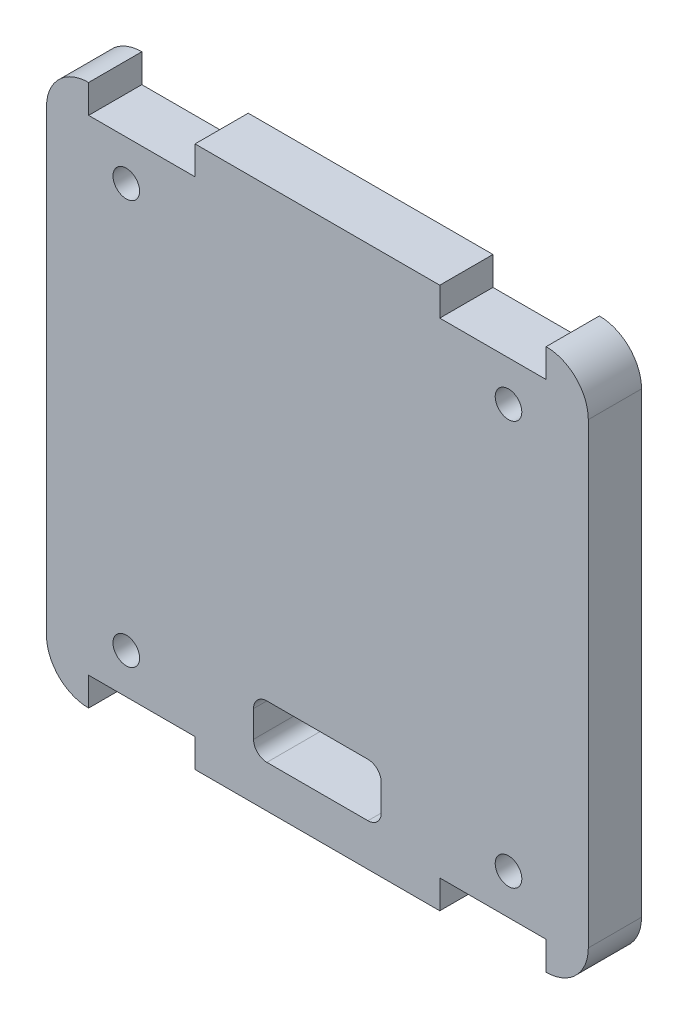
ISO-10303-21;
HEADER;
FILE_DESCRIPTION(('STEP AP214'),'2;1');
FILE_NAME('part.step','',(''),(''),'','','');
FILE_SCHEMA(('AUTOMOTIVE_DESIGN { 1 0 10303 214 1 1 1 1 }'));
ENDSEC;
DATA;
#1=APPLICATION_CONTEXT('core data for automotive mechanical design processes');
#2=APPLICATION_PROTOCOL_DEFINITION('international standard','automotive_design',2000,#1);
#3=PRODUCT_CONTEXT('',#1,'mechanical');
#4=PRODUCT('Part','Part','',(#3));
#5=PRODUCT_RELATED_PRODUCT_CATEGORY('part','',(#4));
#6=PRODUCT_DEFINITION_FORMATION('','',#4);
#7=PRODUCT_DEFINITION_CONTEXT('part definition',#1,'design');
#8=PRODUCT_DEFINITION('design','',#6,#7);
#9=PRODUCT_DEFINITION_SHAPE('','',#8);
#10=(LENGTH_UNIT() NAMED_UNIT(*) SI_UNIT(.MILLI.,.METRE.));
#11=(NAMED_UNIT(*) PLANE_ANGLE_UNIT() SI_UNIT($,.RADIAN.));
#12=(NAMED_UNIT(*) SI_UNIT($,.STERADIAN.) SOLID_ANGLE_UNIT());
#13=UNCERTAINTY_MEASURE_WITH_UNIT(LENGTH_MEASURE(1.E-05),#10,'distance_accuracy_value','');
#14=(GEOMETRIC_REPRESENTATION_CONTEXT(3) GLOBAL_UNCERTAINTY_ASSIGNED_CONTEXT((#13)) GLOBAL_UNIT_ASSIGNED_CONTEXT((#10,
#11,#12)) REPRESENTATION_CONTEXT('',''));
#15=CARTESIAN_POINT('',(0.,0.,0.));
#16=DIRECTION('',(0.,0.,1.));
#17=DIRECTION('',(1.,0.,0.));
#18=AXIS2_PLACEMENT_3D('',#15,#16,#17);
#19=CARTESIAN_POINT('',(8667.40632080673,2967.6948528034,6.35));
#20=DIRECTION('',(0.,0.,1.));
#21=DIRECTION('',(1.,0.,0.));
#22=AXIS2_PLACEMENT_3D('',#19,#20,#21);
#23=PLANE('',#22);
#24=CARTESIAN_POINT('',(8617.29212080673,2916.2598528034,6.35));
#25=DIRECTION('',(0.,0.,1.));
#26=DIRECTION('',(1.,0.,0.));
#27=AXIS2_PLACEMENT_3D('',#24,#25,#26);
#28=CIRCLE('',#27,1.58749999999941);
#29=CARTESIAN_POINT('',(8618.87962080673,2916.2598528034,6.35));
#30=VERTEX_POINT('',#29);
#31=EDGE_CURVE('E287',#30,#30,#28,.T.);
#32=ORIENTED_EDGE('',*,*,#31,.F.);
#33=EDGE_LOOP('',(#32));
#34=FACE_BOUND('',#33,.T.);
#35=CARTESIAN_POINT('',(8662.91052080673,2916.2598528034,6.35));
#36=DIRECTION('',(0.,0.,1.));
#37=DIRECTION('',(1.,0.,0.));
#38=AXIS2_PLACEMENT_3D('',#35,#36,#37);
#39=CIRCLE('',#38,1.58749999999941);
#40=CARTESIAN_POINT('',(8664.49802080673,2916.2598528034,6.35));
#41=VERTEX_POINT('',#40);
#42=EDGE_CURVE('E299',#41,#41,#39,.T.);
#43=ORIENTED_EDGE('',*,*,#42,.F.);
#44=EDGE_LOOP('',(#43));
#45=FACE_BOUND('',#44,.T.);
#46=CARTESIAN_POINT('',(8667.40632080673,2967.6948528034,6.35));
#47=DIRECTION('',(0.,0.,1.));
#48=DIRECTION('',(1.,0.,0.));
#49=AXIS2_PLACEMENT_3D('',#46,#47,#48);
#50=CIRCLE('',#49,5.02920000000051);
#51=CARTESIAN_POINT('',(8672.43552080673,2967.6948528034,6.35));
#52=VERTEX_POINT('',#51);
#53=CARTESIAN_POINT('',(8667.40632080673,2972.7240528034,6.35));
#54=VERTEX_POINT('',#53);
#55=EDGE_CURVE('E311',#52,#54,#50,.T.);
#56=ORIENTED_EDGE('',*,*,#55,.T.);
#57=DIRECTION('',(-1.04381057668354E-12,-1.,0.));
#58=VECTOR('',#57,1.);
#59=CARTESIAN_POINT('',(8667.40632080673,2969.3204528034,6.35));
#60=LINE('',#59,#58);
#61=CARTESIAN_POINT('',(8667.40632080673,2969.3204528034,6.35));
#62=VERTEX_POINT('',#61);
#63=EDGE_CURVE('E314',#54,#62,#60,.T.);
#64=ORIENTED_EDGE('',*,*,#63,.T.);
#65=DIRECTION('',(-1.,0.,0.));
#66=VECTOR('',#65,1.);
#67=CARTESIAN_POINT('',(8654.70632080673,2969.3204528034,6.35));
#68=LINE('',#67,#66);
#69=CARTESIAN_POINT('',(8654.70632080673,2969.3204528034,6.35));
#70=VERTEX_POINT('',#69);
#71=EDGE_CURVE('E317',#62,#70,#68,.T.);
#72=ORIENTED_EDGE('',*,*,#71,.T.);
#73=DIRECTION('',(1.04381057668354E-12,1.,0.));
#74=VECTOR('',#73,1.);
#75=CARTESIAN_POINT('',(8654.70632080673,2969.3204528034,6.35));
#76=LINE('',#75,#74);
#77=CARTESIAN_POINT('',(8654.70632080674,2972.7240528034,6.35));
#78=VERTEX_POINT('',#77);
#79=EDGE_CURVE('E319',#70,#78,#76,.T.);
#80=ORIENTED_EDGE('',*,*,#79,.T.);
#81=DIRECTION('',(-1.,0.,0.));
#82=VECTOR('',#81,1.);
#83=CARTESIAN_POINT('',(8625.49632080673,2972.7240528034,6.35));
#84=LINE('',#83,#82);
#85=CARTESIAN_POINT('',(8625.49632080673,2972.7240528034,6.35));
#86=VERTEX_POINT('',#85);
#87=EDGE_CURVE('E321',#78,#86,#84,.T.);
#88=ORIENTED_EDGE('',*,*,#87,.T.);
#89=DIRECTION('',(0.,-1.,0.));
#90=VECTOR('',#89,1.);
#91=CARTESIAN_POINT('',(8625.49632080673,2969.3204528034,6.35));
#92=LINE('',#91,#90);
#93=CARTESIAN_POINT('',(8625.49632080673,2969.3204528034,6.35));
#94=VERTEX_POINT('',#93);
#95=EDGE_CURVE('E323',#86,#94,#92,.T.);
#96=ORIENTED_EDGE('',*,*,#95,.T.);
#97=DIRECTION('',(-1.,0.,0.));
#98=VECTOR('',#97,1.);
#99=CARTESIAN_POINT('',(8612.79632080673,2969.3204528034,6.35));
#100=LINE('',#99,#98);
#101=CARTESIAN_POINT('',(8612.79632080673,2969.3204528034,6.35));
#102=VERTEX_POINT('',#101);
#103=EDGE_CURVE('E325',#94,#102,#100,.T.);
#104=ORIENTED_EDGE('',*,*,#103,.T.);
#105=DIRECTION('',(0.,1.,0.));
#106=VECTOR('',#105,1.);
#107=CARTESIAN_POINT('',(8612.79632080673,2969.3204528034,6.35));
#108=LINE('',#107,#106);
#109=CARTESIAN_POINT('',(8612.79632080673,2972.7240528034,6.35));
#110=VERTEX_POINT('',#109);
#111=EDGE_CURVE('E327',#102,#110,#108,.T.);
#112=ORIENTED_EDGE('',*,*,#111,.T.);
#113=CARTESIAN_POINT('',(8612.79632080673,2967.6948528034,6.35));
#114=DIRECTION('',(0.,0.,1.));
#115=DIRECTION('',(1.,0.,0.));
#116=AXIS2_PLACEMENT_3D('',#113,#114,#115);
#117=CIRCLE('',#116,5.02919999999896);
#118=CARTESIAN_POINT('',(8607.76712080673,2967.6948528034,6.35));
#119=VERTEX_POINT('',#118);
#120=EDGE_CURVE('E329',#110,#119,#117,.T.);
#121=ORIENTED_EDGE('',*,*,#120,.T.);
#122=DIRECTION('',(0.,-1.,0.));
#123=VECTOR('',#122,1.);
#124=CARTESIAN_POINT('',(8607.76712080673,2913.0848528034,6.35));
#125=LINE('',#124,#123);
#126=CARTESIAN_POINT('',(8607.76712080673,2913.0848528034,6.35));
#127=VERTEX_POINT('',#126);
#128=EDGE_CURVE('E331',#119,#127,#125,.T.);
#129=ORIENTED_EDGE('',*,*,#128,.T.);
#130=CARTESIAN_POINT('',(8612.79632080673,2913.0848528034,6.35));
#131=DIRECTION('',(0.,0.,1.));
#132=DIRECTION('',(1.,0.,0.));
#133=AXIS2_PLACEMENT_3D('',#130,#131,#132);
#134=CIRCLE('',#133,5.02920000000073);
#135=CARTESIAN_POINT('',(8612.79632080673,2908.0556528034,6.35));
#136=VERTEX_POINT('',#135);
#137=EDGE_CURVE('E333',#127,#136,#134,.T.);
#138=ORIENTED_EDGE('',*,*,#137,.T.);
#139=DIRECTION('',(0.,1.,0.));
#140=VECTOR('',#139,1.);
#141=CARTESIAN_POINT('',(8612.79632080673,2911.4592528034,6.35));
#142=LINE('',#141,#140);
#143=CARTESIAN_POINT('',(8612.79632080673,2911.4592528034,6.35));
#144=VERTEX_POINT('',#143);
#145=EDGE_CURVE('E335',#136,#144,#142,.T.);
#146=ORIENTED_EDGE('',*,*,#145,.T.);
#147=DIRECTION('',(1.,0.,0.));
#148=VECTOR('',#147,1.);
#149=CARTESIAN_POINT('',(8625.49632080673,2911.4592528034,6.35));
#150=LINE('',#149,#148);
#151=CARTESIAN_POINT('',(8625.49632080673,2911.4592528034,6.35));
#152=VERTEX_POINT('',#151);
#153=EDGE_CURVE('E337',#144,#152,#150,.T.);
#154=ORIENTED_EDGE('',*,*,#153,.T.);
#155=DIRECTION('',(1.04381057668381E-12,-1.,0.));
#156=VECTOR('',#155,1.);
#157=CARTESIAN_POINT('',(8625.49632080673,2911.4592528034,6.35));
#158=LINE('',#157,#156);
#159=CARTESIAN_POINT('',(8625.49632080673,2908.0556528034,6.35));
#160=VERTEX_POINT('',#159);
#161=EDGE_CURVE('E339',#152,#160,#158,.T.);
#162=ORIENTED_EDGE('',*,*,#161,.T.);
#163=DIRECTION('',(1.,0.,0.));
#164=VECTOR('',#163,1.);
#165=CARTESIAN_POINT('',(8654.70632080673,2908.0556528034,6.35));
#166=LINE('',#165,#164);
#167=CARTESIAN_POINT('',(8654.70632080673,2908.0556528034,6.35));
#168=VERTEX_POINT('',#167);
#169=EDGE_CURVE('E341',#160,#168,#166,.T.);
#170=ORIENTED_EDGE('',*,*,#169,.T.);
#171=DIRECTION('',(0.,1.,0.));
#172=VECTOR('',#171,1.);
#173=CARTESIAN_POINT('',(8654.70632080673,2911.4592528034,6.35));
#174=LINE('',#173,#172);
#175=CARTESIAN_POINT('',(8654.70632080673,2911.4592528034,6.35));
#176=VERTEX_POINT('',#175);
#177=EDGE_CURVE('E343',#168,#176,#174,.T.);
#178=ORIENTED_EDGE('',*,*,#177,.T.);
#179=DIRECTION('',(1.,0.,0.));
#180=VECTOR('',#179,1.);
#181=CARTESIAN_POINT('',(8667.40632080673,2911.4592528034,6.35));
#182=LINE('',#181,#180);
#183=CARTESIAN_POINT('',(8667.40632080673,2911.4592528034,6.35));
#184=VERTEX_POINT('',#183);
#185=EDGE_CURVE('E345',#176,#184,#182,.T.);
#186=ORIENTED_EDGE('',*,*,#185,.T.);
#187=DIRECTION('',(1.04381057668422E-12,-1.,0.));
#188=VECTOR('',#187,1.);
#189=CARTESIAN_POINT('',(8667.40632080673,2911.4592528034,6.35));
#190=LINE('',#189,#188);
#191=CARTESIAN_POINT('',(8667.40632080673,2908.0556528034,6.35));
#192=VERTEX_POINT('',#191);
#193=EDGE_CURVE('E347',#184,#192,#190,.T.);
#194=ORIENTED_EDGE('',*,*,#193,.T.);
#195=CARTESIAN_POINT('',(8667.40632080673,2913.0848528034,6.35));
#196=DIRECTION('',(0.,0.,1.));
#197=DIRECTION('',(1.,0.,0.));
#198=AXIS2_PLACEMENT_3D('',#195,#196,#197);
#199=CIRCLE('',#198,5.02919999999896);
#200=CARTESIAN_POINT('',(8672.43552080673,2913.0848528034,6.35));
#201=VERTEX_POINT('',#200);
#202=EDGE_CURVE('E349',#192,#201,#199,.T.);
#203=ORIENTED_EDGE('',*,*,#202,.T.);
#204=DIRECTION('',(0.,1.,0.));
#205=VECTOR('',#204,1.);
#206=CARTESIAN_POINT('',(8672.43552080673,2967.6948528034,6.35));
#207=LINE('',#206,#205);
#208=EDGE_CURVE('E351',#201,#52,#207,.T.);
#209=ORIENTED_EDGE('',*,*,#208,.T.);
#210=EDGE_LOOP('',(#56,#64,#72,#80,#88,#96,#104,#112,#121,#129,#138,#146,#154,#162,#170,#178,
#186,#194,#203,#209));
#211=FACE_BOUND('',#210,.T.);
#212=CARTESIAN_POINT('',(8662.91052080673,2964.5198528034,6.35));
#213=DIRECTION('',(0.,0.,1.));
#214=DIRECTION('',(1.,0.,0.));
#215=AXIS2_PLACEMENT_3D('',#212,#213,#214);
#216=CIRCLE('',#215,1.58749999999941);
#217=CARTESIAN_POINT('',(8664.49802080673,2964.5198528034,6.35));
#218=VERTEX_POINT('',#217);
#219=EDGE_CURVE('E305',#218,#218,#216,.T.);
#220=ORIENTED_EDGE('',*,*,#219,.F.);
#221=EDGE_LOOP('',(#220));
#222=FACE_BOUND('',#221,.T.);
#223=CARTESIAN_POINT('',(8617.29212080673,2964.5198528034,6.35));
#224=DIRECTION('',(0.,0.,1.));
#225=DIRECTION('',(1.,0.,0.));
#226=AXIS2_PLACEMENT_3D('',#223,#224,#225);
#227=CIRCLE('',#226,1.58749999999941);
#228=CARTESIAN_POINT('',(8618.87962080673,2964.5198528034,6.35));
#229=VERTEX_POINT('',#228);
#230=EDGE_CURVE('E293',#229,#229,#227,.T.);
#231=ORIENTED_EDGE('',*,*,#230,.F.);
#232=EDGE_LOOP('',(#231));
#233=FACE_BOUND('',#232,.T.);
#234=DIRECTION('',(1.,0.,0.));
#235=VECTOR('',#234,1.);
#236=CARTESIAN_POINT('',(8634.06882080673,2913.0848528034,6.35));
#237=LINE('',#236,#235);
#238=CARTESIAN_POINT('',(8634.06882080673,2913.0848528034,6.35));
#239=VERTEX_POINT('',#238);
#240=CARTESIAN_POINT('',(8646.13382080673,2913.0848528034,6.35));
#241=VERTEX_POINT('',#240);
#242=EDGE_CURVE('E230',#239,#241,#237,.T.);
#243=ORIENTED_EDGE('',*,*,#242,.F.);
#244=CARTESIAN_POINT('',(8634.06882080673,2914.6723528034,6.35));
#245=DIRECTION('',(0.,0.,1.));
#246=DIRECTION('',(1.,0.,0.));
#247=AXIS2_PLACEMENT_3D('',#244,#245,#246);
#248=CIRCLE('',#247,1.58749999999985);
#249=CARTESIAN_POINT('',(8632.48132080673,2914.6723528034,6.35));
#250=VERTEX_POINT('',#249);
#251=EDGE_CURVE('E222',#250,#239,#248,.T.);
#252=ORIENTED_EDGE('',*,*,#251,.F.);
#253=DIRECTION('',(0.,-1.,0.));
#254=VECTOR('',#253,1.);
#255=CARTESIAN_POINT('',(8632.48132080673,2917.8473528034,6.35));
#256=LINE('',#255,#254);
#257=CARTESIAN_POINT('',(8632.48132080673,2917.8473528034,6.35));
#258=VERTEX_POINT('',#257);
#259=EDGE_CURVE('E255',#258,#250,#256,.T.);
#260=ORIENTED_EDGE('',*,*,#259,.F.);
#261=CARTESIAN_POINT('',(8634.06882080673,2917.8473528034,6.35));
#262=DIRECTION('',(0.,0.,1.));
#263=DIRECTION('',(1.,0.,0.));
#264=AXIS2_PLACEMENT_3D('',#261,#262,#263);
#265=CIRCLE('',#264,1.58749999999985);
#266=CARTESIAN_POINT('',(8634.06882080673,2919.4348528034,6.35));
#267=VERTEX_POINT('',#266);
#268=EDGE_CURVE('E253',#267,#258,#265,.T.);
#269=ORIENTED_EDGE('',*,*,#268,.F.);
#270=DIRECTION('',(-1.,0.,0.));
#271=VECTOR('',#270,1.);
#272=CARTESIAN_POINT('',(8646.13382080673,2919.4348528034,6.35));
#273=LINE('',#272,#271);
#274=CARTESIAN_POINT('',(8646.13382080673,2919.4348528034,6.35));
#275=VERTEX_POINT('',#274);
#276=EDGE_CURVE('E251',#275,#267,#273,.T.);
#277=ORIENTED_EDGE('',*,*,#276,.F.);
#278=CARTESIAN_POINT('',(8646.13382080673,2917.8473528034,6.35));
#279=DIRECTION('',(0.,0.,1.));
#280=DIRECTION('',(1.,0.,0.));
#281=AXIS2_PLACEMENT_3D('',#278,#279,#280);
#282=CIRCLE('',#281,1.58750000000074);
#283=CARTESIAN_POINT('',(8647.72132080673,2917.8473528034,6.35));
#284=VERTEX_POINT('',#283);
#285=EDGE_CURVE('E249',#284,#275,#282,.T.);
#286=ORIENTED_EDGE('',*,*,#285,.F.);
#287=DIRECTION('',(0.,1.,0.));
#288=VECTOR('',#287,1.);
#289=CARTESIAN_POINT('',(8647.72132080673,2914.6723528034,6.35));
#290=LINE('',#289,#288);
#291=CARTESIAN_POINT('',(8647.72132080673,2914.6723528034,6.35));
#292=VERTEX_POINT('',#291);
#293=EDGE_CURVE('E245',#292,#284,#290,.T.);
#294=ORIENTED_EDGE('',*,*,#293,.F.);
#295=CARTESIAN_POINT('',(8646.13382080673,2914.6723528034,6.35));
#296=DIRECTION('',(0.,0.,1.));
#297=DIRECTION('',(1.,0.,0.));
#298=AXIS2_PLACEMENT_3D('',#295,#296,#297);
#299=CIRCLE('',#298,1.58750000000074);
#300=EDGE_CURVE('E243',#241,#292,#299,.T.);
#301=ORIENTED_EDGE('',*,*,#300,.F.);
#302=EDGE_LOOP('',(#243,#252,#260,#269,#277,#286,#294,#301));
#303=FACE_BOUND('',#302,.T.);
#304=ADVANCED_FACE('F37',(#34,#45,#211,#222,#233,#303),#23,.T.);
#305=CARTESIAN_POINT('',(8667.40632080673,2967.6948528034,0.));
#306=DIRECTION('',(0.,0.,1.));
#307=DIRECTION('',(1.,0.,0.));
#308=AXIS2_PLACEMENT_3D('',#305,#306,#307);
#309=PLANE('',#308);
#310=CARTESIAN_POINT('',(8617.29212080673,2916.2598528034,0.));
#311=DIRECTION('',(0.,0.,1.));
#312=DIRECTION('',(1.,0.,0.));
#313=AXIS2_PLACEMENT_3D('',#310,#311,#312);
#314=CIRCLE('',#313,1.58749999999941);
#315=CARTESIAN_POINT('',(8618.87962080673,2916.2598528034,0.));
#316=VERTEX_POINT('',#315);
#317=EDGE_CURVE('E238',#316,#316,#314,.T.);
#318=ORIENTED_EDGE('',*,*,#317,.T.);
#319=EDGE_LOOP('',(#318));
#320=FACE_BOUND('',#319,.T.);
#321=CARTESIAN_POINT('',(8662.91052080673,2916.2598528034,0.));
#322=DIRECTION('',(0.,0.,1.));
#323=DIRECTION('',(1.,0.,0.));
#324=AXIS2_PLACEMENT_3D('',#321,#322,#323);
#325=CIRCLE('',#324,1.58749999999941);
#326=CARTESIAN_POINT('',(8664.49802080673,2916.2598528034,0.));
#327=VERTEX_POINT('',#326);
#328=EDGE_CURVE('E296',#327,#327,#325,.T.);
#329=ORIENTED_EDGE('',*,*,#328,.T.);
#330=EDGE_LOOP('',(#329));
#331=FACE_BOUND('',#330,.T.);
#332=CARTESIAN_POINT('',(8667.40632080673,2967.6948528034,0.));
#333=DIRECTION('',(0.,0.,1.));
#334=DIRECTION('',(1.,0.,0.));
#335=AXIS2_PLACEMENT_3D('',#332,#333,#334);
#336=CIRCLE('',#335,5.02920000000051);
#337=CARTESIAN_POINT('',(8672.43552080673,2967.6948528034,0.));
#338=VERTEX_POINT('',#337);
#339=CARTESIAN_POINT('',(8667.40632080673,2972.7240528034,0.));
#340=VERTEX_POINT('',#339);
#341=EDGE_CURVE('E308',#338,#340,#336,.T.);
#342=ORIENTED_EDGE('',*,*,#341,.F.);
#343=DIRECTION('',(0.,1.,0.));
#344=VECTOR('',#343,1.);
#345=CARTESIAN_POINT('',(8672.43552080673,2967.6948528034,0.));
#346=LINE('',#345,#344);
#347=CARTESIAN_POINT('',(8672.43552080673,2913.0848528034,0.));
#348=VERTEX_POINT('',#347);
#349=EDGE_CURVE('E315',#348,#338,#346,.T.);
#350=ORIENTED_EDGE('',*,*,#349,.F.);
#351=CARTESIAN_POINT('',(8667.40632080673,2913.0848528034,0.));
#352=DIRECTION('',(0.,0.,1.));
#353=DIRECTION('',(1.,0.,0.));
#354=AXIS2_PLACEMENT_3D('',#351,#352,#353);
#355=CIRCLE('',#354,5.02919999999896);
#356=CARTESIAN_POINT('',(8667.40632080673,2908.0556528034,0.));
#357=VERTEX_POINT('',#356);
#358=EDGE_CURVE('E390',#357,#348,#355,.T.);
#359=ORIENTED_EDGE('',*,*,#358,.F.);
#360=DIRECTION('',(1.04381057668422E-12,-1.,0.));
#361=VECTOR('',#360,1.);
#362=CARTESIAN_POINT('',(8667.40632080673,2911.4592528034,0.));
#363=LINE('',#362,#361);
#364=CARTESIAN_POINT('',(8667.40632080673,2911.4592528034,0.));
#365=VERTEX_POINT('',#364);
#366=EDGE_CURVE('E388',#365,#357,#363,.T.);
#367=ORIENTED_EDGE('',*,*,#366,.F.);
#368=DIRECTION('',(1.,0.,0.));
#369=VECTOR('',#368,1.);
#370=CARTESIAN_POINT('',(8667.40632080673,2911.4592528034,0.));
#371=LINE('',#370,#369);
#372=CARTESIAN_POINT('',(8654.70632080673,2911.4592528034,0.));
#373=VERTEX_POINT('',#372);
#374=EDGE_CURVE('E386',#373,#365,#371,.T.);
#375=ORIENTED_EDGE('',*,*,#374,.F.);
#376=DIRECTION('',(0.,1.,0.));
#377=VECTOR('',#376,1.);
#378=CARTESIAN_POINT('',(8654.70632080673,2911.4592528034,0.));
#379=LINE('',#378,#377);
#380=CARTESIAN_POINT('',(8654.70632080673,2908.0556528034,0.));
#381=VERTEX_POINT('',#380);
#382=EDGE_CURVE('E384',#381,#373,#379,.T.);
#383=ORIENTED_EDGE('',*,*,#382,.F.);
#384=DIRECTION('',(1.,0.,0.));
#385=VECTOR('',#384,1.);
#386=CARTESIAN_POINT('',(8654.70632080673,2908.0556528034,0.));
#387=LINE('',#386,#385);
#388=CARTESIAN_POINT('',(8625.49632080673,2908.0556528034,0.));
#389=VERTEX_POINT('',#388);
#390=EDGE_CURVE('E382',#389,#381,#387,.T.);
#391=ORIENTED_EDGE('',*,*,#390,.F.);
#392=DIRECTION('',(1.04381057668381E-12,-1.,0.));
#393=VECTOR('',#392,1.);
#394=CARTESIAN_POINT('',(8625.49632080673,2911.4592528034,0.));
#395=LINE('',#394,#393);
#396=CARTESIAN_POINT('',(8625.49632080673,2911.4592528034,0.));
#397=VERTEX_POINT('',#396);
#398=EDGE_CURVE('E380',#397,#389,#395,.T.);
#399=ORIENTED_EDGE('',*,*,#398,.F.);
#400=DIRECTION('',(1.,0.,0.));
#401=VECTOR('',#400,1.);
#402=CARTESIAN_POINT('',(8625.49632080673,2911.4592528034,0.));
#403=LINE('',#402,#401);
#404=CARTESIAN_POINT('',(8612.79632080673,2911.4592528034,0.));
#405=VERTEX_POINT('',#404);
#406=EDGE_CURVE('E378',#405,#397,#403,.T.);
#407=ORIENTED_EDGE('',*,*,#406,.F.);
#408=DIRECTION('',(0.,1.,0.));
#409=VECTOR('',#408,1.);
#410=CARTESIAN_POINT('',(8612.79632080673,2911.4592528034,0.));
#411=LINE('',#410,#409);
#412=CARTESIAN_POINT('',(8612.79632080673,2908.0556528034,0.));
#413=VERTEX_POINT('',#412);
#414=EDGE_CURVE('E376',#413,#405,#411,.T.);
#415=ORIENTED_EDGE('',*,*,#414,.F.);
#416=CARTESIAN_POINT('',(8612.79632080673,2913.0848528034,0.));
#417=DIRECTION('',(0.,0.,1.));
#418=DIRECTION('',(1.,0.,0.));
#419=AXIS2_PLACEMENT_3D('',#416,#417,#418);
#420=CIRCLE('',#419,5.02920000000073);
#421=CARTESIAN_POINT('',(8607.76712080673,2913.0848528034,0.));
#422=VERTEX_POINT('',#421);
#423=EDGE_CURVE('E374',#422,#413,#420,.T.);
#424=ORIENTED_EDGE('',*,*,#423,.F.);
#425=DIRECTION('',(0.,-1.,0.));
#426=VECTOR('',#425,1.);
#427=CARTESIAN_POINT('',(8607.76712080673,2913.0848528034,0.));
#428=LINE('',#427,#426);
#429=CARTESIAN_POINT('',(8607.76712080673,2967.6948528034,0.));
#430=VERTEX_POINT('',#429);
#431=EDGE_CURVE('E372',#430,#422,#428,.T.);
#432=ORIENTED_EDGE('',*,*,#431,.F.);
#433=CARTESIAN_POINT('',(8612.79632080673,2967.6948528034,0.));
#434=DIRECTION('',(0.,0.,1.));
#435=DIRECTION('',(1.,0.,0.));
#436=AXIS2_PLACEMENT_3D('',#433,#434,#435);
#437=CIRCLE('',#436,5.02919999999896);
#438=CARTESIAN_POINT('',(8612.79632080673,2972.7240528034,0.));
#439=VERTEX_POINT('',#438);
#440=EDGE_CURVE('E370',#439,#430,#437,.T.);
#441=ORIENTED_EDGE('',*,*,#440,.F.);
#442=DIRECTION('',(0.,1.,0.));
#443=VECTOR('',#442,1.);
#444=CARTESIAN_POINT('',(8612.79632080673,2969.3204528034,0.));
#445=LINE('',#444,#443);
#446=CARTESIAN_POINT('',(8612.79632080673,2969.3204528034,0.));
#447=VERTEX_POINT('',#446);
#448=EDGE_CURVE('E368',#447,#439,#445,.T.);
#449=ORIENTED_EDGE('',*,*,#448,.F.);
#450=DIRECTION('',(-1.,0.,0.));
#451=VECTOR('',#450,1.);
#452=CARTESIAN_POINT('',(8612.79632080673,2969.3204528034,0.));
#453=LINE('',#452,#451);
#454=CARTESIAN_POINT('',(8625.49632080673,2969.3204528034,0.));
#455=VERTEX_POINT('',#454);
#456=EDGE_CURVE('E366',#455,#447,#453,.T.);
#457=ORIENTED_EDGE('',*,*,#456,.F.);
#458=DIRECTION('',(0.,-1.,0.));
#459=VECTOR('',#458,1.);
#460=CARTESIAN_POINT('',(8625.49632080673,2969.3204528034,0.));
#461=LINE('',#460,#459);
#462=CARTESIAN_POINT('',(8625.49632080673,2972.7240528034,0.));
#463=VERTEX_POINT('',#462);
#464=EDGE_CURVE('E364',#463,#455,#461,.T.);
#465=ORIENTED_EDGE('',*,*,#464,.F.);
#466=DIRECTION('',(-1.,0.,0.));
#467=VECTOR('',#466,1.);
#468=CARTESIAN_POINT('',(8625.49632080673,2972.7240528034,0.));
#469=LINE('',#468,#467);
#470=CARTESIAN_POINT('',(8654.70632080674,2972.7240528034,0.));
#471=VERTEX_POINT('',#470);
#472=EDGE_CURVE('E362',#471,#463,#469,.T.);
#473=ORIENTED_EDGE('',*,*,#472,.F.);
#474=DIRECTION('',(1.04381057668354E-12,1.,0.));
#475=VECTOR('',#474,1.);
#476=CARTESIAN_POINT('',(8654.70632080673,2969.3204528034,0.));
#477=LINE('',#476,#475);
#478=CARTESIAN_POINT('',(8654.70632080673,2969.3204528034,0.));
#479=VERTEX_POINT('',#478);
#480=EDGE_CURVE('E360',#479,#471,#477,.T.);
#481=ORIENTED_EDGE('',*,*,#480,.F.);
#482=DIRECTION('',(-1.,0.,0.));
#483=VECTOR('',#482,1.);
#484=CARTESIAN_POINT('',(8654.70632080673,2969.3204528034,0.));
#485=LINE('',#484,#483);
#486=CARTESIAN_POINT('',(8667.40632080673,2969.3204528034,0.));
#487=VERTEX_POINT('',#486);
#488=EDGE_CURVE('E358',#487,#479,#485,.T.);
#489=ORIENTED_EDGE('',*,*,#488,.F.);
#490=DIRECTION('',(-1.04381057668354E-12,-1.,0.));
#491=VECTOR('',#490,1.);
#492=CARTESIAN_POINT('',(8667.40632080673,2969.3204528034,0.));
#493=LINE('',#492,#491);
#494=EDGE_CURVE('E356',#340,#487,#493,.T.);
#495=ORIENTED_EDGE('',*,*,#494,.F.);
#496=EDGE_LOOP('',(#342,#350,#359,#367,#375,#383,#391,#399,#407,#415,#424,#432,#441,#449,#457,
#465,#473,#481,#489,#495));
#497=FACE_BOUND('',#496,.T.);
#498=CARTESIAN_POINT('',(8662.91052080673,2964.5198528034,0.));
#499=DIRECTION('',(0.,0.,1.));
#500=DIRECTION('',(1.,0.,0.));
#501=AXIS2_PLACEMENT_3D('',#498,#499,#500);
#502=CIRCLE('',#501,1.58749999999941);
#503=CARTESIAN_POINT('',(8664.49802080673,2964.5198528034,0.));
#504=VERTEX_POINT('',#503);
#505=EDGE_CURVE('E302',#504,#504,#502,.T.);
#506=ORIENTED_EDGE('',*,*,#505,.T.);
#507=EDGE_LOOP('',(#506));
#508=FACE_BOUND('',#507,.T.);
#509=CARTESIAN_POINT('',(8617.29212080673,2964.5198528034,0.));
#510=DIRECTION('',(0.,0.,1.));
#511=DIRECTION('',(1.,0.,0.));
#512=AXIS2_PLACEMENT_3D('',#509,#510,#511);
#513=CIRCLE('',#512,1.58749999999941);
#514=CARTESIAN_POINT('',(8618.87962080673,2964.5198528034,0.));
#515=VERTEX_POINT('',#514);
#516=EDGE_CURVE('E290',#515,#515,#513,.T.);
#517=ORIENTED_EDGE('',*,*,#516,.T.);
#518=EDGE_LOOP('',(#517));
#519=FACE_BOUND('',#518,.T.);
#520=CARTESIAN_POINT('',(8634.06882080673,2914.6723528034,0.));
#521=DIRECTION('',(0.,0.,1.));
#522=DIRECTION('',(1.,0.,0.));
#523=AXIS2_PLACEMENT_3D('',#520,#521,#522);
#524=CIRCLE('',#523,1.58749999999985);
#525=CARTESIAN_POINT('',(8632.48132080673,2914.6723528034,0.));
#526=VERTEX_POINT('',#525);
#527=CARTESIAN_POINT('',(8634.06882080673,2913.0848528034,0.));
#528=VERTEX_POINT('',#527);
#529=EDGE_CURVE('E60',#526,#528,#524,.T.);
#530=ORIENTED_EDGE('',*,*,#529,.T.);
#531=DIRECTION('',(1.,0.,0.));
#532=VECTOR('',#531,1.);
#533=CARTESIAN_POINT('',(8634.06882080673,2913.0848528034,0.));
#534=LINE('',#533,#532);
#535=CARTESIAN_POINT('',(8646.13382080673,2913.0848528034,0.));
#536=VERTEX_POINT('',#535);
#537=EDGE_CURVE('E237',#528,#536,#534,.T.);
#538=ORIENTED_EDGE('',*,*,#537,.T.);
#539=CARTESIAN_POINT('',(8646.13382080673,2914.6723528034,0.));
#540=DIRECTION('',(0.,0.,1.));
#541=DIRECTION('',(1.,0.,0.));
#542=AXIS2_PLACEMENT_3D('',#539,#540,#541);
#543=CIRCLE('',#542,1.58750000000074);
#544=CARTESIAN_POINT('',(8647.72132080673,2914.6723528034,0.));
#545=VERTEX_POINT('',#544);
#546=EDGE_CURVE('E259',#536,#545,#543,.T.);
#547=ORIENTED_EDGE('',*,*,#546,.T.);
#548=DIRECTION('',(0.,1.,0.));
#549=VECTOR('',#548,1.);
#550=CARTESIAN_POINT('',(8647.72132080673,2914.6723528034,0.));
#551=LINE('',#550,#549);
#552=CARTESIAN_POINT('',(8647.72132080673,2917.8473528034,0.));
#553=VERTEX_POINT('',#552);
#554=EDGE_CURVE('E262',#545,#553,#551,.T.);
#555=ORIENTED_EDGE('',*,*,#554,.T.);
#556=CARTESIAN_POINT('',(8646.13382080673,2917.8473528034,0.));
#557=DIRECTION('',(0.,0.,1.));
#558=DIRECTION('',(1.,0.,0.));
#559=AXIS2_PLACEMENT_3D('',#556,#557,#558);
#560=CIRCLE('',#559,1.58750000000074);
#561=CARTESIAN_POINT('',(8646.13382080673,2919.4348528034,0.));
#562=VERTEX_POINT('',#561);
#563=EDGE_CURVE('E265',#553,#562,#560,.T.);
#564=ORIENTED_EDGE('',*,*,#563,.T.);
#565=DIRECTION('',(-1.,0.,0.));
#566=VECTOR('',#565,1.);
#567=CARTESIAN_POINT('',(8646.13382080673,2919.4348528034,0.));
#568=LINE('',#567,#566);
#569=CARTESIAN_POINT('',(8634.06882080673,2919.4348528034,0.));
#570=VERTEX_POINT('',#569);
#571=EDGE_CURVE('E268',#562,#570,#568,.T.);
#572=ORIENTED_EDGE('',*,*,#571,.T.);
#573=CARTESIAN_POINT('',(8634.06882080673,2917.8473528034,0.));
#574=DIRECTION('',(0.,0.,1.));
#575=DIRECTION('',(1.,0.,0.));
#576=AXIS2_PLACEMENT_3D('',#573,#574,#575);
#577=CIRCLE('',#576,1.58749999999985);
#578=CARTESIAN_POINT('',(8632.48132080673,2917.8473528034,0.));
#579=VERTEX_POINT('',#578);
#580=EDGE_CURVE('E271',#570,#579,#577,.T.);
#581=ORIENTED_EDGE('',*,*,#580,.T.);
#582=DIRECTION('',(0.,-1.,0.));
#583=VECTOR('',#582,1.);
#584=CARTESIAN_POINT('',(8632.48132080673,2917.8473528034,0.));
#585=LINE('',#584,#583);
#586=EDGE_CURVE('E231',#579,#526,#585,.T.);
#587=ORIENTED_EDGE('',*,*,#586,.T.);
#588=EDGE_LOOP('',(#530,#538,#547,#555,#564,#572,#581,#587));
#589=FACE_BOUND('',#588,.T.);
#590=ADVANCED_FACE('F456',(#320,#331,#497,#508,#519,#589),#309,.F.);
#591=CARTESIAN_POINT('',(8667.40632080673,2967.6948528034,6.35));
#592=DIRECTION('',(0.,0.,-1.));
#593=DIRECTION('',(-1.,0.,0.));
#594=AXIS2_PLACEMENT_3D('',#591,#592,#593);
#595=CYLINDRICAL_SURFACE('',#594,5.02920000000051);
#596=ORIENTED_EDGE('',*,*,#341,.T.);
#597=DIRECTION('',(0.,0.,-1.));
#598=VECTOR('',#597,1.);
#599=CARTESIAN_POINT('',(8667.40632080673,2972.7240528034,6.35));
#600=LINE('',#599,#598);
#601=EDGE_CURVE('E11',#54,#340,#600,.T.);
#602=ORIENTED_EDGE('',*,*,#601,.F.);
#603=ORIENTED_EDGE('',*,*,#55,.F.);
#604=DIRECTION('',(0.,0.,-1.));
#605=VECTOR('',#604,1.);
#606=CARTESIAN_POINT('',(8672.43552080673,2967.6948528034,6.35));
#607=LINE('',#606,#605);
#608=EDGE_CURVE('E353',#52,#338,#607,.T.);
#609=ORIENTED_EDGE('',*,*,#608,.T.);
#610=EDGE_LOOP('',(#596,#602,#603,#609));
#611=FACE_BOUND('',#610,.T.);
#612=ADVANCED_FACE('F39',(#611),#595,.T.);
#613=CARTESIAN_POINT('',(8667.40632080673,2969.3204528034,6.35));
#614=DIRECTION('',(1.,-1.04381057668354E-12,0.));
#615=DIRECTION('',(1.04381057668354E-12,1.,0.));
#616=AXIS2_PLACEMENT_3D('',#613,#614,#615);
#617=PLANE('',#616);
#618=ORIENTED_EDGE('',*,*,#494,.T.);
#619=DIRECTION('',(0.,0.,-1.));
#620=VECTOR('',#619,1.);
#621=CARTESIAN_POINT('',(8667.40632080673,2969.3204528034,6.35));
#622=LINE('',#621,#620);
#623=EDGE_CURVE('E45',#62,#487,#622,.T.);
#624=ORIENTED_EDGE('',*,*,#623,.F.);
#625=ORIENTED_EDGE('',*,*,#63,.F.);
#626=ORIENTED_EDGE('',*,*,#601,.T.);
#627=EDGE_LOOP('',(#618,#624,#625,#626));
#628=FACE_BOUND('',#627,.T.);
#629=ADVANCED_FACE('F474',(#628),#617,.F.);
#630=CARTESIAN_POINT('',(8654.70632080673,2969.3204528034,6.35));
#631=DIRECTION('',(0.,-1.,0.));
#632=DIRECTION('',(0.,0.,-1.));
#633=AXIS2_PLACEMENT_3D('',#630,#631,#632);
#634=PLANE('',#633);
#635=ORIENTED_EDGE('',*,*,#488,.T.);
#636=DIRECTION('',(0.,0.,-1.));
#637=VECTOR('',#636,1.);
#638=CARTESIAN_POINT('',(8654.70632080673,2969.3204528034,6.35));
#639=LINE('',#638,#637);
#640=EDGE_CURVE('E443',#70,#479,#639,.T.);
#641=ORIENTED_EDGE('',*,*,#640,.F.);
#642=ORIENTED_EDGE('',*,*,#71,.F.);
#643=ORIENTED_EDGE('',*,*,#623,.T.);
#644=EDGE_LOOP('',(#635,#641,#642,#643));
#645=FACE_BOUND('',#644,.T.);
#646=ADVANCED_FACE('F450',(#645),#634,.F.);
#647=CARTESIAN_POINT('',(8654.70632080673,2969.3204528034,6.35));
#648=DIRECTION('',(-1.,1.04381057668354E-12,0.));
#649=DIRECTION('',(-1.04381057668354E-12,-1.,0.));
#650=AXIS2_PLACEMENT_3D('',#647,#648,#649);
#651=PLANE('',#650);
#652=ORIENTED_EDGE('',*,*,#480,.T.);
#653=DIRECTION('',(0.,0.,-1.));
#654=VECTOR('',#653,1.);
#655=CARTESIAN_POINT('',(8654.70632080674,2972.7240528034,6.35));
#656=LINE('',#655,#654);
#657=EDGE_CURVE('E440',#78,#471,#656,.T.);
#658=ORIENTED_EDGE('',*,*,#657,.F.);
#659=ORIENTED_EDGE('',*,*,#79,.F.);
#660=ORIENTED_EDGE('',*,*,#640,.T.);
#661=EDGE_LOOP('',(#652,#658,#659,#660));
#662=FACE_BOUND('',#661,.T.);
#663=ADVANCED_FACE('F462',(#662),#651,.F.);
#664=CARTESIAN_POINT('',(8625.49632080673,2972.7240528034,6.35));
#665=DIRECTION('',(0.,-1.,0.));
#666=DIRECTION('',(0.,0.,-1.));
#667=AXIS2_PLACEMENT_3D('',#664,#665,#666);
#668=PLANE('',#667);
#669=ORIENTED_EDGE('',*,*,#472,.T.);
#670=DIRECTION('',(0.,0.,-1.));
#671=VECTOR('',#670,1.);
#672=CARTESIAN_POINT('',(8625.49632080673,2972.7240528034,6.35));
#673=LINE('',#672,#671);
#674=EDGE_CURVE('E437',#86,#463,#673,.T.);
#675=ORIENTED_EDGE('',*,*,#674,.F.);
#676=ORIENTED_EDGE('',*,*,#87,.F.);
#677=ORIENTED_EDGE('',*,*,#657,.T.);
#678=EDGE_LOOP('',(#669,#675,#676,#677));
#679=FACE_BOUND('',#678,.T.);
#680=ADVANCED_FACE('F466',(#679),#668,.F.);
#681=CARTESIAN_POINT('',(8625.49632080673,2969.3204528034,6.35));
#682=DIRECTION('',(1.,0.,0.));
#683=DIRECTION('',(0.,0.,-1.));
#684=AXIS2_PLACEMENT_3D('',#681,#682,#683);
#685=PLANE('',#684);
#686=ORIENTED_EDGE('',*,*,#464,.T.);
#687=DIRECTION('',(0.,0.,-1.));
#688=VECTOR('',#687,1.);
#689=CARTESIAN_POINT('',(8625.49632080673,2969.3204528034,6.35));
#690=LINE('',#689,#688);
#691=EDGE_CURVE('E434',#94,#455,#690,.T.);
#692=ORIENTED_EDGE('',*,*,#691,.F.);
#693=ORIENTED_EDGE('',*,*,#95,.F.);
#694=ORIENTED_EDGE('',*,*,#674,.T.);
#695=EDGE_LOOP('',(#686,#692,#693,#694));
#696=FACE_BOUND('',#695,.T.);
#697=ADVANCED_FACE('F547',(#696),#685,.F.);
#698=CARTESIAN_POINT('',(8612.79632080673,2969.3204528034,6.35));
#699=DIRECTION('',(0.,-1.,0.));
#700=DIRECTION('',(0.,0.,-1.));
#701=AXIS2_PLACEMENT_3D('',#698,#699,#700);
#702=PLANE('',#701);
#703=ORIENTED_EDGE('',*,*,#456,.T.);
#704=DIRECTION('',(0.,0.,-1.));
#705=VECTOR('',#704,1.);
#706=CARTESIAN_POINT('',(8612.79632080673,2969.3204528034,6.35));
#707=LINE('',#706,#705);
#708=EDGE_CURVE('E431',#102,#447,#707,.T.);
#709=ORIENTED_EDGE('',*,*,#708,.F.);
#710=ORIENTED_EDGE('',*,*,#103,.F.);
#711=ORIENTED_EDGE('',*,*,#691,.T.);
#712=EDGE_LOOP('',(#703,#709,#710,#711));
#713=FACE_BOUND('',#712,.T.);
#714=ADVANCED_FACE('F545',(#713),#702,.F.);
#715=CARTESIAN_POINT('',(8612.79632080673,2969.3204528034,6.35));
#716=DIRECTION('',(-1.,0.,0.));
#717=DIRECTION('',(0.,0.,1.));
#718=AXIS2_PLACEMENT_3D('',#715,#716,#717);
#719=PLANE('',#718);
#720=ORIENTED_EDGE('',*,*,#448,.T.);
#721=DIRECTION('',(0.,0.,-1.));
#722=VECTOR('',#721,1.);
#723=CARTESIAN_POINT('',(8612.79632080673,2972.7240528034,6.35));
#724=LINE('',#723,#722);
#725=EDGE_CURVE('E428',#110,#439,#724,.T.);
#726=ORIENTED_EDGE('',*,*,#725,.F.);
#727=ORIENTED_EDGE('',*,*,#111,.F.);
#728=ORIENTED_EDGE('',*,*,#708,.T.);
#729=EDGE_LOOP('',(#720,#726,#727,#728));
#730=FACE_BOUND('',#729,.T.);
#731=ADVANCED_FACE('F540',(#730),#719,.F.);
#732=CARTESIAN_POINT('',(8612.79632080673,2967.6948528034,6.35));
#733=DIRECTION('',(0.,0.,-1.));
#734=DIRECTION('',(-1.,0.,0.));
#735=AXIS2_PLACEMENT_3D('',#732,#733,#734);
#736=CYLINDRICAL_SURFACE('',#735,5.02919999999896);
#737=ORIENTED_EDGE('',*,*,#440,.T.);
#738=DIRECTION('',(0.,0.,-1.));
#739=VECTOR('',#738,1.);
#740=CARTESIAN_POINT('',(8607.76712080673,2967.6948528034,6.35));
#741=LINE('',#740,#739);
#742=EDGE_CURVE('E425',#119,#430,#741,.T.);
#743=ORIENTED_EDGE('',*,*,#742,.F.);
#744=ORIENTED_EDGE('',*,*,#120,.F.);
#745=ORIENTED_EDGE('',*,*,#725,.T.);
#746=EDGE_LOOP('',(#737,#743,#744,#745));
#747=FACE_BOUND('',#746,.T.);
#748=ADVANCED_FACE('F535',(#747),#736,.T.);
#749=CARTESIAN_POINT('',(8607.76712080673,2913.0848528034,6.35));
#750=DIRECTION('',(1.,0.,0.));
#751=DIRECTION('',(0.,1.,0.));
#752=AXIS2_PLACEMENT_3D('',#749,#750,#751);
#753=PLANE('',#752);
#754=ORIENTED_EDGE('',*,*,#431,.T.);
#755=DIRECTION('',(0.,0.,-1.));
#756=VECTOR('',#755,1.);
#757=CARTESIAN_POINT('',(8607.76712080673,2913.0848528034,6.35));
#758=LINE('',#757,#756);
#759=EDGE_CURVE('E422',#127,#422,#758,.T.);
#760=ORIENTED_EDGE('',*,*,#759,.F.);
#761=ORIENTED_EDGE('',*,*,#128,.F.);
#762=ORIENTED_EDGE('',*,*,#742,.T.);
#763=EDGE_LOOP('',(#754,#760,#761,#762));
#764=FACE_BOUND('',#763,.T.);
#765=ADVANCED_FACE('F531',(#764),#753,.F.);
#766=CARTESIAN_POINT('',(8612.79632080673,2913.0848528034,6.35));
#767=DIRECTION('',(0.,0.,-1.));
#768=DIRECTION('',(-1.,0.,0.));
#769=AXIS2_PLACEMENT_3D('',#766,#767,#768);
#770=CYLINDRICAL_SURFACE('',#769,5.02920000000073);
#771=ORIENTED_EDGE('',*,*,#423,.T.);
#772=DIRECTION('',(0.,0.,-1.));
#773=VECTOR('',#772,1.);
#774=CARTESIAN_POINT('',(8612.79632080673,2908.0556528034,6.35));
#775=LINE('',#774,#773);
#776=EDGE_CURVE('E419',#136,#413,#775,.T.);
#777=ORIENTED_EDGE('',*,*,#776,.F.);
#778=ORIENTED_EDGE('',*,*,#137,.F.);
#779=ORIENTED_EDGE('',*,*,#759,.T.);
#780=EDGE_LOOP('',(#771,#777,#778,#779));
#781=FACE_BOUND('',#780,.T.);
#782=ADVANCED_FACE('F526',(#781),#770,.T.);
#783=CARTESIAN_POINT('',(8612.79632080673,2911.4592528034,6.35));
#784=DIRECTION('',(-1.,0.,0.));
#785=DIRECTION('',(0.,0.,1.));
#786=AXIS2_PLACEMENT_3D('',#783,#784,#785);
#787=PLANE('',#786);
#788=ORIENTED_EDGE('',*,*,#414,.T.);
#789=DIRECTION('',(0.,0.,-1.));
#790=VECTOR('',#789,1.);
#791=CARTESIAN_POINT('',(8612.79632080673,2911.4592528034,6.35));
#792=LINE('',#791,#790);
#793=EDGE_CURVE('E416',#144,#405,#792,.T.);
#794=ORIENTED_EDGE('',*,*,#793,.F.);
#795=ORIENTED_EDGE('',*,*,#145,.F.);
#796=ORIENTED_EDGE('',*,*,#776,.T.);
#797=EDGE_LOOP('',(#788,#794,#795,#796));
#798=FACE_BOUND('',#797,.T.);
#799=ADVANCED_FACE('F520',(#798),#787,.F.);
#800=CARTESIAN_POINT('',(8625.49632080673,2911.4592528034,6.35));
#801=DIRECTION('',(0.,1.,0.));
#802=DIRECTION('',(0.,0.,1.));
#803=AXIS2_PLACEMENT_3D('',#800,#801,#802);
#804=PLANE('',#803);
#805=ORIENTED_EDGE('',*,*,#406,.T.);
#806=DIRECTION('',(0.,0.,-1.));
#807=VECTOR('',#806,1.);
#808=CARTESIAN_POINT('',(8625.49632080673,2911.4592528034,6.35));
#809=LINE('',#808,#807);
#810=EDGE_CURVE('E413',#152,#397,#809,.T.);
#811=ORIENTED_EDGE('',*,*,#810,.F.);
#812=ORIENTED_EDGE('',*,*,#153,.F.);
#813=ORIENTED_EDGE('',*,*,#793,.T.);
#814=EDGE_LOOP('',(#805,#811,#812,#813));
#815=FACE_BOUND('',#814,.T.);
#816=ADVANCED_FACE('F516',(#815),#804,.F.);
#817=CARTESIAN_POINT('',(8625.49632080673,2911.4592528034,6.35));
#818=DIRECTION('',(1.,1.04381057668381E-12,0.));
#819=DIRECTION('',(-1.04381057668381E-12,1.,0.));
#820=AXIS2_PLACEMENT_3D('',#817,#818,#819);
#821=PLANE('',#820);
#822=ORIENTED_EDGE('',*,*,#398,.T.);
#823=DIRECTION('',(0.,0.,-1.));
#824=VECTOR('',#823,1.);
#825=CARTESIAN_POINT('',(8625.49632080673,2908.0556528034,6.35));
#826=LINE('',#825,#824);
#827=EDGE_CURVE('E410',#160,#389,#826,.T.);
#828=ORIENTED_EDGE('',*,*,#827,.F.);
#829=ORIENTED_EDGE('',*,*,#161,.F.);
#830=ORIENTED_EDGE('',*,*,#810,.T.);
#831=EDGE_LOOP('',(#822,#828,#829,#830));
#832=FACE_BOUND('',#831,.T.);
#833=ADVANCED_FACE('F511',(#832),#821,.F.);
#834=CARTESIAN_POINT('',(8654.70632080673,2908.0556528034,6.35));
#835=DIRECTION('',(0.,1.,0.));
#836=DIRECTION('',(0.,0.,1.));
#837=AXIS2_PLACEMENT_3D('',#834,#835,#836);
#838=PLANE('',#837);
#839=ORIENTED_EDGE('',*,*,#390,.T.);
#840=DIRECTION('',(0.,0.,-1.));
#841=VECTOR('',#840,1.);
#842=CARTESIAN_POINT('',(8654.70632080673,2908.0556528034,6.35));
#843=LINE('',#842,#841);
#844=EDGE_CURVE('E407',#168,#381,#843,.T.);
#845=ORIENTED_EDGE('',*,*,#844,.F.);
#846=ORIENTED_EDGE('',*,*,#169,.F.);
#847=ORIENTED_EDGE('',*,*,#827,.T.);
#848=EDGE_LOOP('',(#839,#845,#846,#847));
#849=FACE_BOUND('',#848,.T.);
#850=ADVANCED_FACE('F505',(#849),#838,.F.);
#851=CARTESIAN_POINT('',(8654.70632080673,2911.4592528034,6.35));
#852=DIRECTION('',(-1.,0.,0.));
#853=DIRECTION('',(0.,0.,1.));
#854=AXIS2_PLACEMENT_3D('',#851,#852,#853);
#855=PLANE('',#854);
#856=ORIENTED_EDGE('',*,*,#382,.T.);
#857=DIRECTION('',(0.,0.,-1.));
#858=VECTOR('',#857,1.);
#859=CARTESIAN_POINT('',(8654.70632080673,2911.4592528034,6.35));
#860=LINE('',#859,#858);
#861=EDGE_CURVE('E404',#176,#373,#860,.T.);
#862=ORIENTED_EDGE('',*,*,#861,.F.);
#863=ORIENTED_EDGE('',*,*,#177,.F.);
#864=ORIENTED_EDGE('',*,*,#844,.T.);
#865=EDGE_LOOP('',(#856,#862,#863,#864));
#866=FACE_BOUND('',#865,.T.);
#867=ADVANCED_FACE('F501',(#866),#855,.F.);
#868=CARTESIAN_POINT('',(8667.40632080673,2911.4592528034,6.35));
#869=DIRECTION('',(0.,1.,0.));
#870=DIRECTION('',(0.,0.,1.));
#871=AXIS2_PLACEMENT_3D('',#868,#869,#870);
#872=PLANE('',#871);
#873=ORIENTED_EDGE('',*,*,#374,.T.);
#874=DIRECTION('',(0.,0.,-1.));
#875=VECTOR('',#874,1.);
#876=CARTESIAN_POINT('',(8667.40632080673,2911.4592528034,6.35));
#877=LINE('',#876,#875);
#878=EDGE_CURVE('E401',#184,#365,#877,.T.);
#879=ORIENTED_EDGE('',*,*,#878,.F.);
#880=ORIENTED_EDGE('',*,*,#185,.F.);
#881=ORIENTED_EDGE('',*,*,#861,.T.);
#882=EDGE_LOOP('',(#873,#879,#880,#881));
#883=FACE_BOUND('',#882,.T.);
#884=ADVANCED_FACE('F496',(#883),#872,.F.);
#885=CARTESIAN_POINT('',(8667.40632080673,2911.4592528034,6.35));
#886=DIRECTION('',(1.,1.04381057668422E-12,0.));
#887=DIRECTION('',(-1.04381057668422E-12,1.,0.));
#888=AXIS2_PLACEMENT_3D('',#885,#886,#887);
#889=PLANE('',#888);
#890=ORIENTED_EDGE('',*,*,#366,.T.);
#891=DIRECTION('',(0.,0.,-1.));
#892=VECTOR('',#891,1.);
#893=CARTESIAN_POINT('',(8667.40632080673,2908.0556528034,6.35));
#894=LINE('',#893,#892);
#895=EDGE_CURVE('E398',#192,#357,#894,.T.);
#896=ORIENTED_EDGE('',*,*,#895,.F.);
#897=ORIENTED_EDGE('',*,*,#193,.F.);
#898=ORIENTED_EDGE('',*,*,#878,.T.);
#899=EDGE_LOOP('',(#890,#896,#897,#898));
#900=FACE_BOUND('',#899,.T.);
#901=ADVANCED_FACE('F490',(#900),#889,.F.);
#902=CARTESIAN_POINT('',(8667.40632080673,2913.0848528034,6.35));
#903=DIRECTION('',(0.,0.,-1.));
#904=DIRECTION('',(-1.,0.,0.));
#905=AXIS2_PLACEMENT_3D('',#902,#903,#904);
#906=CYLINDRICAL_SURFACE('',#905,5.02919999999896);
#907=ORIENTED_EDGE('',*,*,#358,.T.);
#908=DIRECTION('',(0.,0.,-1.));
#909=VECTOR('',#908,1.);
#910=CARTESIAN_POINT('',(8672.43552080673,2913.0848528034,6.35));
#911=LINE('',#910,#909);
#912=EDGE_CURVE('E395',#201,#348,#911,.T.);
#913=ORIENTED_EDGE('',*,*,#912,.F.);
#914=ORIENTED_EDGE('',*,*,#202,.F.);
#915=ORIENTED_EDGE('',*,*,#895,.T.);
#916=EDGE_LOOP('',(#907,#913,#914,#915));
#917=FACE_BOUND('',#916,.T.);
#918=ADVANCED_FACE('F486',(#917),#906,.T.);
#919=CARTESIAN_POINT('',(8672.43552080673,2967.6948528034,6.35));
#920=DIRECTION('',(-1.,0.,0.));
#921=DIRECTION('',(0.,-1.,0.));
#922=AXIS2_PLACEMENT_3D('',#919,#920,#921);
#923=PLANE('',#922);
#924=ORIENTED_EDGE('',*,*,#349,.T.);
#925=ORIENTED_EDGE('',*,*,#608,.F.);
#926=ORIENTED_EDGE('',*,*,#208,.F.);
#927=ORIENTED_EDGE('',*,*,#912,.T.);
#928=EDGE_LOOP('',(#924,#925,#926,#927));
#929=FACE_BOUND('',#928,.T.);
#930=ADVANCED_FACE('F481',(#929),#923,.F.);
#931=CARTESIAN_POINT('',(8662.91052080673,2964.5198528034,6.35));
#932=DIRECTION('',(0.,0.,-1.));
#933=DIRECTION('',(-1.,0.,0.));
#934=AXIS2_PLACEMENT_3D('',#931,#932,#933);
#935=CYLINDRICAL_SURFACE('',#934,1.58749999999941);
#936=ORIENTED_EDGE('',*,*,#219,.T.);
#937=EDGE_LOOP('',(#936));
#938=FACE_BOUND('',#937,.T.);
#939=ORIENTED_EDGE('',*,*,#505,.F.);
#940=EDGE_LOOP('',(#939));
#941=FACE_BOUND('',#940,.T.);
#942=ADVANCED_FACE('F567',(#938,#941),#935,.F.);
#943=CARTESIAN_POINT('',(8662.91052080673,2916.2598528034,6.35));
#944=DIRECTION('',(0.,0.,-1.));
#945=DIRECTION('',(-1.,0.,0.));
#946=AXIS2_PLACEMENT_3D('',#943,#944,#945);
#947=CYLINDRICAL_SURFACE('',#946,1.58749999999941);
#948=ORIENTED_EDGE('',*,*,#42,.T.);
#949=EDGE_LOOP('',(#948));
#950=FACE_BOUND('',#949,.T.);
#951=ORIENTED_EDGE('',*,*,#328,.F.);
#952=EDGE_LOOP('',(#951));
#953=FACE_BOUND('',#952,.T.);
#954=ADVANCED_FACE('F653',(#950,#953),#947,.F.);
#955=CARTESIAN_POINT('',(8617.29212080673,2964.5198528034,6.35));
#956=DIRECTION('',(0.,0.,-1.));
#957=DIRECTION('',(-1.,0.,0.));
#958=AXIS2_PLACEMENT_3D('',#955,#956,#957);
#959=CYLINDRICAL_SURFACE('',#958,1.58749999999941);
#960=ORIENTED_EDGE('',*,*,#230,.T.);
#961=EDGE_LOOP('',(#960));
#962=FACE_BOUND('',#961,.T.);
#963=ORIENTED_EDGE('',*,*,#516,.F.);
#964=EDGE_LOOP('',(#963));
#965=FACE_BOUND('',#964,.T.);
#966=ADVANCED_FACE('F660',(#962,#965),#959,.F.);
#967=CARTESIAN_POINT('',(8617.29212080673,2916.2598528034,6.35));
#968=DIRECTION('',(0.,0.,-1.));
#969=DIRECTION('',(-1.,0.,0.));
#970=AXIS2_PLACEMENT_3D('',#967,#968,#969);
#971=CYLINDRICAL_SURFACE('',#970,1.58749999999941);
#972=ORIENTED_EDGE('',*,*,#31,.T.);
#973=EDGE_LOOP('',(#972));
#974=FACE_BOUND('',#973,.T.);
#975=ORIENTED_EDGE('',*,*,#317,.F.);
#976=EDGE_LOOP('',(#975));
#977=FACE_BOUND('',#976,.T.);
#978=ADVANCED_FACE('F667',(#974,#977),#971,.F.);
#979=CARTESIAN_POINT('',(8634.06882080673,2914.6723528034,6.35));
#980=DIRECTION('',(0.,0.,-1.));
#981=DIRECTION('',(-1.,0.,0.));
#982=AXIS2_PLACEMENT_3D('',#979,#980,#981);
#983=CYLINDRICAL_SURFACE('',#982,1.58749999999985);
#984=ORIENTED_EDGE('',*,*,#529,.F.);
#985=DIRECTION('',(0.,0.,-1.));
#986=VECTOR('',#985,1.);
#987=CARTESIAN_POINT('',(8632.48132080673,2914.6723528034,6.35));
#988=LINE('',#987,#986);
#989=EDGE_CURVE('E226',#250,#526,#988,.T.);
#990=ORIENTED_EDGE('',*,*,#989,.F.);
#991=ORIENTED_EDGE('',*,*,#251,.T.);
#992=DIRECTION('',(0.,0.,-1.));
#993=VECTOR('',#992,1.);
#994=CARTESIAN_POINT('',(8634.06882080673,2913.0848528034,6.35));
#995=LINE('',#994,#993);
#996=EDGE_CURVE('E225',#239,#528,#995,.T.);
#997=ORIENTED_EDGE('',*,*,#996,.T.);
#998=EDGE_LOOP('',(#984,#990,#991,#997));
#999=FACE_BOUND('',#998,.T.);
#1000=ADVANCED_FACE('F224',(#999),#983,.F.);
#1001=CARTESIAN_POINT('',(8634.06882080673,2913.0848528034,6.35));
#1002=DIRECTION('',(0.,1.,0.));
#1003=DIRECTION('',(0.,0.,1.));
#1004=AXIS2_PLACEMENT_3D('',#1001,#1002,#1003);
#1005=PLANE('',#1004);
#1006=ORIENTED_EDGE('',*,*,#537,.F.);
#1007=ORIENTED_EDGE('',*,*,#996,.F.);
#1008=ORIENTED_EDGE('',*,*,#242,.T.);
#1009=DIRECTION('',(0.,0.,-1.));
#1010=VECTOR('',#1009,1.);
#1011=CARTESIAN_POINT('',(8646.13382080673,2913.0848528034,6.35));
#1012=LINE('',#1011,#1010);
#1013=EDGE_CURVE('E239',#241,#536,#1012,.T.);
#1014=ORIENTED_EDGE('',*,*,#1013,.T.);
#1015=EDGE_LOOP('',(#1006,#1007,#1008,#1014));
#1016=FACE_BOUND('',#1015,.T.);
#1017=ADVANCED_FACE('F234',(#1016),#1005,.T.);
#1018=CARTESIAN_POINT('',(8646.13382080673,2914.6723528034,6.35));
#1019=DIRECTION('',(0.,0.,-1.));
#1020=DIRECTION('',(-1.,0.,0.));
#1021=AXIS2_PLACEMENT_3D('',#1018,#1019,#1020);
#1022=CYLINDRICAL_SURFACE('',#1021,1.58750000000074);
#1023=ORIENTED_EDGE('',*,*,#546,.F.);
#1024=ORIENTED_EDGE('',*,*,#1013,.F.);
#1025=ORIENTED_EDGE('',*,*,#300,.T.);
#1026=DIRECTION('',(0.,0.,-1.));
#1027=VECTOR('',#1026,1.);
#1028=CARTESIAN_POINT('',(8647.72132080673,2914.6723528034,6.35));
#1029=LINE('',#1028,#1027);
#1030=EDGE_CURVE('E284',#292,#545,#1029,.T.);
#1031=ORIENTED_EDGE('',*,*,#1030,.T.);
#1032=EDGE_LOOP('',(#1023,#1024,#1025,#1031));
#1033=FACE_BOUND('',#1032,.T.);
#1034=ADVANCED_FACE('F688',(#1033),#1022,.F.);
#1035=CARTESIAN_POINT('',(8647.72132080673,2914.6723528034,6.35));
#1036=DIRECTION('',(-1.,0.,0.));
#1037=DIRECTION('',(0.,0.,1.));
#1038=AXIS2_PLACEMENT_3D('',#1035,#1036,#1037);
#1039=PLANE('',#1038);
#1040=ORIENTED_EDGE('',*,*,#554,.F.);
#1041=ORIENTED_EDGE('',*,*,#1030,.F.);
#1042=ORIENTED_EDGE('',*,*,#293,.T.);
#1043=DIRECTION('',(0.,0.,-1.));
#1044=VECTOR('',#1043,1.);
#1045=CARTESIAN_POINT('',(8647.72132080673,2917.8473528034,6.35));
#1046=LINE('',#1045,#1044);
#1047=EDGE_CURVE('E282',#284,#553,#1046,.T.);
#1048=ORIENTED_EDGE('',*,*,#1047,.T.);
#1049=EDGE_LOOP('',(#1040,#1041,#1042,#1048));
#1050=FACE_BOUND('',#1049,.T.);
#1051=ADVANCED_FACE('F695',(#1050),#1039,.T.);
#1052=CARTESIAN_POINT('',(8646.13382080673,2917.8473528034,6.35));
#1053=DIRECTION('',(0.,0.,-1.));
#1054=DIRECTION('',(-1.,0.,0.));
#1055=AXIS2_PLACEMENT_3D('',#1052,#1053,#1054);
#1056=CYLINDRICAL_SURFACE('',#1055,1.58750000000074);
#1057=ORIENTED_EDGE('',*,*,#563,.F.);
#1058=ORIENTED_EDGE('',*,*,#1047,.F.);
#1059=ORIENTED_EDGE('',*,*,#285,.T.);
#1060=DIRECTION('',(0.,0.,-1.));
#1061=VECTOR('',#1060,1.);
#1062=CARTESIAN_POINT('',(8646.13382080673,2919.4348528034,6.35));
#1063=LINE('',#1062,#1061);
#1064=EDGE_CURVE('E280',#275,#562,#1063,.T.);
#1065=ORIENTED_EDGE('',*,*,#1064,.T.);
#1066=EDGE_LOOP('',(#1057,#1058,#1059,#1065));
#1067=FACE_BOUND('',#1066,.T.);
#1068=ADVANCED_FACE('F703',(#1067),#1056,.F.);
#1069=CARTESIAN_POINT('',(8646.13382080673,2919.4348528034,6.35));
#1070=DIRECTION('',(0.,-1.,0.));
#1071=DIRECTION('',(0.,0.,-1.));
#1072=AXIS2_PLACEMENT_3D('',#1069,#1070,#1071);
#1073=PLANE('',#1072);
#1074=ORIENTED_EDGE('',*,*,#571,.F.);
#1075=ORIENTED_EDGE('',*,*,#1064,.F.);
#1076=ORIENTED_EDGE('',*,*,#276,.T.);
#1077=DIRECTION('',(0.,0.,-1.));
#1078=VECTOR('',#1077,1.);
#1079=CARTESIAN_POINT('',(8634.06882080673,2919.4348528034,6.35));
#1080=LINE('',#1079,#1078);
#1081=EDGE_CURVE('E278',#267,#570,#1080,.T.);
#1082=ORIENTED_EDGE('',*,*,#1081,.T.);
#1083=EDGE_LOOP('',(#1074,#1075,#1076,#1082));
#1084=FACE_BOUND('',#1083,.T.);
#1085=ADVANCED_FACE('F711',(#1084),#1073,.T.);
#1086=CARTESIAN_POINT('',(8634.06882080673,2917.8473528034,6.35));
#1087=DIRECTION('',(0.,0.,-1.));
#1088=DIRECTION('',(-1.,0.,0.));
#1089=AXIS2_PLACEMENT_3D('',#1086,#1087,#1088);
#1090=CYLINDRICAL_SURFACE('',#1089,1.58749999999985);
#1091=ORIENTED_EDGE('',*,*,#580,.F.);
#1092=ORIENTED_EDGE('',*,*,#1081,.F.);
#1093=ORIENTED_EDGE('',*,*,#268,.T.);
#1094=DIRECTION('',(0.,0.,-1.));
#1095=VECTOR('',#1094,1.);
#1096=CARTESIAN_POINT('',(8632.48132080673,2917.8473528034,6.35));
#1097=LINE('',#1096,#1095);
#1098=EDGE_CURVE('E52',#258,#579,#1097,.T.);
#1099=ORIENTED_EDGE('',*,*,#1098,.T.);
#1100=EDGE_LOOP('',(#1091,#1092,#1093,#1099));
#1101=FACE_BOUND('',#1100,.T.);
#1102=ADVANCED_FACE('F719',(#1101),#1090,.F.);
#1103=CARTESIAN_POINT('',(8632.48132080673,2917.8473528034,6.35));
#1104=DIRECTION('',(1.,0.,0.));
#1105=DIRECTION('',(0.,0.,-1.));
#1106=AXIS2_PLACEMENT_3D('',#1103,#1104,#1105);
#1107=PLANE('',#1106);
#1108=ORIENTED_EDGE('',*,*,#586,.F.);
#1109=ORIENTED_EDGE('',*,*,#1098,.F.);
#1110=ORIENTED_EDGE('',*,*,#259,.T.);
#1111=ORIENTED_EDGE('',*,*,#989,.T.);
#1112=EDGE_LOOP('',(#1108,#1109,#1110,#1111));
#1113=FACE_BOUND('',#1112,.T.);
#1114=ADVANCED_FACE('F727',(#1113),#1107,.T.);
#1115=CLOSED_SHELL('',(#304,#590,#612,#629,#646,#663,#680,#697,#714,#731,#748,#765,#782,#799,
#816,#833,#850,#867,#884,#901,#918,#930,#942,#954,#966,#978,#1000,#1017,#1034,#1051,#1068,#1085,
#1102,#1114));
#1116=MANIFOLD_SOLID_BREP('B2',#1115);
#1117=ADVANCED_BREP_SHAPE_REPRESENTATION('',(#18,#1116),#14);
#1118=SHAPE_DEFINITION_REPRESENTATION(#9,#1117);
ENDSEC;
END-ISO-10303-21;
